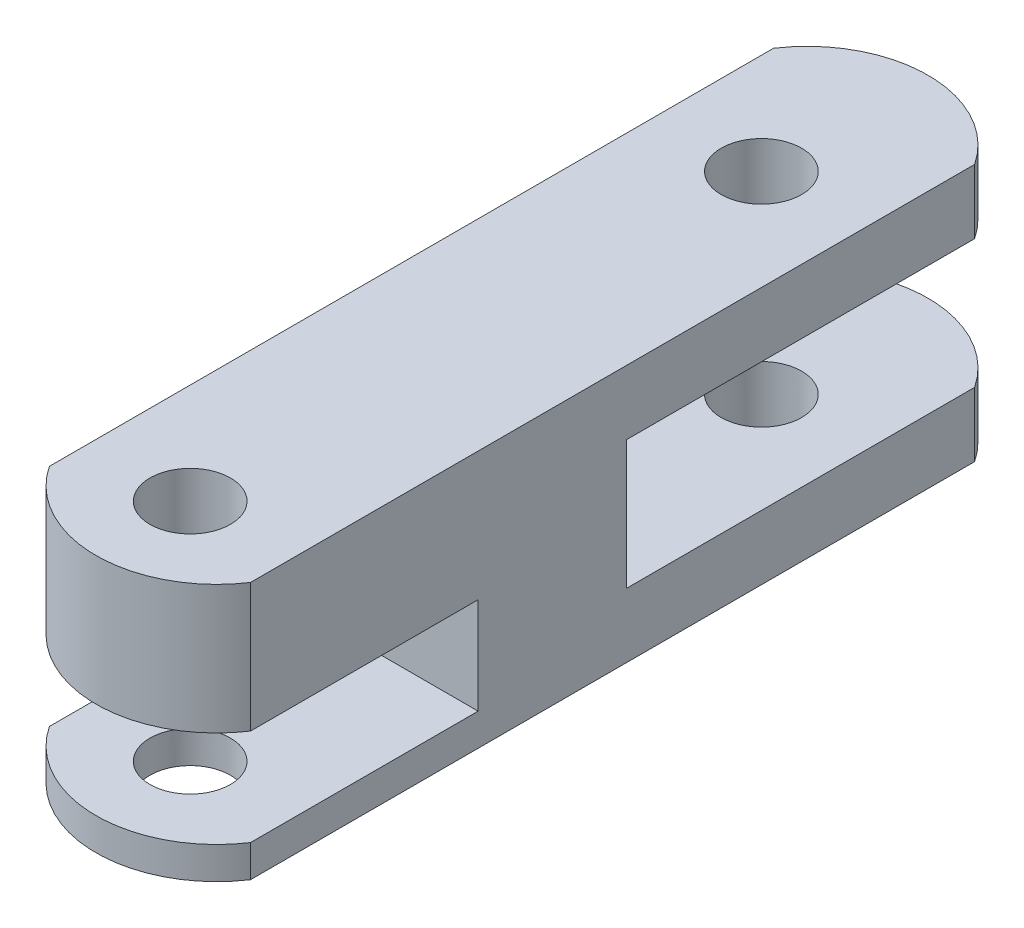
ISO-10303-21;
HEADER;
FILE_DESCRIPTION(('STEP AP214'),'2;1');
FILE_NAME('part.step','',(''),(''),'','','');
FILE_SCHEMA(('AUTOMOTIVE_DESIGN { 1 0 10303 214 1 1 1 1 }'));
ENDSEC;
DATA;
#1=APPLICATION_CONTEXT('core data for automotive mechanical design processes');
#2=APPLICATION_PROTOCOL_DEFINITION('international standard','automotive_design',2000,#1);
#3=PRODUCT_CONTEXT('',#1,'mechanical');
#4=PRODUCT('Part','Part','',(#3));
#5=PRODUCT_RELATED_PRODUCT_CATEGORY('part','',(#4));
#6=PRODUCT_DEFINITION_FORMATION('','',#4);
#7=PRODUCT_DEFINITION_CONTEXT('part definition',#1,'design');
#8=PRODUCT_DEFINITION('design','',#6,#7);
#9=PRODUCT_DEFINITION_SHAPE('','',#8);
#10=(LENGTH_UNIT() NAMED_UNIT(*) SI_UNIT(.MILLI.,.METRE.));
#11=(NAMED_UNIT(*) PLANE_ANGLE_UNIT() SI_UNIT($,.RADIAN.));
#12=(NAMED_UNIT(*) SI_UNIT($,.STERADIAN.) SOLID_ANGLE_UNIT());
#13=UNCERTAINTY_MEASURE_WITH_UNIT(LENGTH_MEASURE(1.E-05),#10,'distance_accuracy_value','');
#14=(GEOMETRIC_REPRESENTATION_CONTEXT(3) GLOBAL_UNCERTAINTY_ASSIGNED_CONTEXT((#13)) GLOBAL_UNIT_ASSIGNED_CONTEXT((#10,
#11,#12)) REPRESENTATION_CONTEXT('',''));
#15=CARTESIAN_POINT('',(0.,0.,0.));
#16=DIRECTION('',(0.,0.,1.));
#17=DIRECTION('',(1.,0.,0.));
#18=AXIS2_PLACEMENT_3D('',#15,#16,#17);
#19=CARTESIAN_POINT('',(0.,16.,-36.7084380241115));
#20=DIRECTION('',(0.,-1.,0.));
#21=DIRECTION('',(0.,0.,-1.));
#22=AXIS2_PLACEMENT_3D('',#19,#20,#21);
#23=CYLINDRICAL_SURFACE('',#22,15.);
#24=DIRECTION('',(0.,-1.,0.));
#25=VECTOR('',#24,1.);
#26=CARTESIAN_POINT('',(12.5,16.,-45.));
#27=LINE('',#26,#25);
#28=CARTESIAN_POINT('',(12.5,16.,-45.));
#29=VERTEX_POINT('',#28);
#30=CARTESIAN_POINT('',(12.5,8.,-45.));
#31=VERTEX_POINT('',#30);
#32=EDGE_CURVE('E216',#29,#31,#27,.T.);
#33=ORIENTED_EDGE('',*,*,#32,.T.);
#34=CARTESIAN_POINT('',(0.,8.,-36.7084380241115));
#35=DIRECTION('',(0.,1.,0.));
#36=DIRECTION('',(0.,0.,1.));
#37=AXIS2_PLACEMENT_3D('',#34,#35,#36);
#38=CIRCLE('',#37,15.);
#39=CARTESIAN_POINT('',(-12.5,8.,-45.));
#40=VERTEX_POINT('',#39);
#41=EDGE_CURVE('E163',#31,#40,#38,.T.);
#42=ORIENTED_EDGE('',*,*,#41,.T.);
#43=DIRECTION('',(0.,-1.,0.));
#44=VECTOR('',#43,1.);
#45=CARTESIAN_POINT('',(-12.5,16.,-45.));
#46=LINE('',#45,#44);
#47=CARTESIAN_POINT('',(-12.5,16.,-45.));
#48=VERTEX_POINT('',#47);
#49=EDGE_CURVE('E213',#48,#40,#46,.T.);
#50=ORIENTED_EDGE('',*,*,#49,.F.);
#51=CARTESIAN_POINT('',(0.,16.,-36.7084380241115));
#52=DIRECTION('',(0.,1.,0.));
#53=DIRECTION('',(0.,0.,-1.));
#54=AXIS2_PLACEMENT_3D('',#51,#52,#53);
#55=CIRCLE('',#54,15.);
#56=EDGE_CURVE('E194',#29,#48,#55,.T.);
#57=ORIENTED_EDGE('',*,*,#56,.F.);
#58=EDGE_LOOP('',(#33,#42,#50,#57));
#59=FACE_BOUND('',#58,.T.);
#60=ADVANCED_FACE('F41',(#59),#23,.T.);
#61=CARTESIAN_POINT('',(0.,16.,36.7084380241115));
#62=DIRECTION('',(0.,-1.,0.));
#63=DIRECTION('',(0.,0.,-1.));
#64=AXIS2_PLACEMENT_3D('',#61,#62,#63);
#65=CYLINDRICAL_SURFACE('',#64,15.);
#66=DIRECTION('',(0.,-1.,0.));
#67=VECTOR('',#66,1.);
#68=CARTESIAN_POINT('',(-12.5,16.,45.));
#69=LINE('',#68,#67);
#70=CARTESIAN_POINT('',(-12.5,16.,45.));
#71=VERTEX_POINT('',#70);
#72=CARTESIAN_POINT('',(-12.5,0.,45.));
#73=VERTEX_POINT('',#72);
#74=EDGE_CURVE('E209',#71,#73,#69,.T.);
#75=ORIENTED_EDGE('',*,*,#74,.T.);
#76=CARTESIAN_POINT('',(0.,0.,36.7084380241115));
#77=DIRECTION('',(0.,1.,0.));
#78=DIRECTION('',(0.,0.,1.));
#79=AXIS2_PLACEMENT_3D('',#76,#77,#78);
#80=CIRCLE('',#79,15.);
#81=CARTESIAN_POINT('',(12.5,0.,45.));
#82=VERTEX_POINT('',#81);
#83=EDGE_CURVE('E184',#73,#82,#80,.T.);
#84=ORIENTED_EDGE('',*,*,#83,.T.);
#85=DIRECTION('',(0.,-1.,0.));
#86=VECTOR('',#85,1.);
#87=CARTESIAN_POINT('',(12.5,16.,45.));
#88=LINE('',#87,#86);
#89=CARTESIAN_POINT('',(12.5,16.,45.));
#90=VERTEX_POINT('',#89);
#91=EDGE_CURVE('E220',#90,#82,#88,.T.);
#92=ORIENTED_EDGE('',*,*,#91,.F.);
#93=CARTESIAN_POINT('',(0.,16.,36.7084380241115));
#94=DIRECTION('',(0.,1.,0.));
#95=DIRECTION('',(0.,0.,1.));
#96=AXIS2_PLACEMENT_3D('',#93,#94,#95);
#97=CIRCLE('',#96,15.);
#98=EDGE_CURVE('E188',#71,#90,#97,.T.);
#99=ORIENTED_EDGE('',*,*,#98,.F.);
#100=EDGE_LOOP('',(#75,#84,#92,#99));
#101=FACE_BOUND('',#100,.T.);
#102=ADVANCED_FACE('F265',(#101),#65,.T.);
#103=CARTESIAN_POINT('',(12.5,-12.,45.));
#104=VERTEX_POINT('',#103);
#105=CARTESIAN_POINT('',(12.5,-16.,45.));
#106=VERTEX_POINT('',#105);
#107=EDGE_CURVE('E219',#104,#106,#88,.T.);
#108=ORIENTED_EDGE('',*,*,#107,.F.);
#109=CARTESIAN_POINT('',(0.,-12.,36.7084380241115));
#110=DIRECTION('',(0.,-1.,0.));
#111=DIRECTION('',(0.,0.,-1.));
#112=AXIS2_PLACEMENT_3D('',#109,#110,#111);
#113=CIRCLE('',#112,15.);
#114=CARTESIAN_POINT('',(-12.5,-12.,45.));
#115=VERTEX_POINT('',#114);
#116=EDGE_CURVE('E180',#104,#115,#113,.T.);
#117=ORIENTED_EDGE('',*,*,#116,.T.);
#118=CARTESIAN_POINT('',(-12.5,-16.,45.));
#119=VERTEX_POINT('',#118);
#120=EDGE_CURVE('E198',#115,#119,#69,.T.);
#121=ORIENTED_EDGE('',*,*,#120,.T.);
#122=CARTESIAN_POINT('',(0.,-16.,36.7084380241115));
#123=DIRECTION('',(0.,1.,0.));
#124=DIRECTION('',(0.,0.,1.));
#125=AXIS2_PLACEMENT_3D('',#122,#123,#124);
#126=CIRCLE('',#125,15.);
#127=EDGE_CURVE('E187',#119,#106,#126,.T.);
#128=ORIENTED_EDGE('',*,*,#127,.T.);
#129=EDGE_LOOP('',(#108,#117,#121,#128));
#130=FACE_BOUND('',#129,.T.);
#131=ADVANCED_FACE('F43',(#130),#65,.T.);
#132=CARTESIAN_POINT('',(12.5,16.,-45.));
#133=DIRECTION('',(-1.,0.,0.));
#134=DIRECTION('',(0.,0.,1.));
#135=AXIS2_PLACEMENT_3D('',#132,#133,#134);
#136=PLANE('',#135);
#137=DIRECTION('',(0.,-1.,0.));
#138=VECTOR('',#137,1.);
#139=CARTESIAN_POINT('',(12.5,8.,-1.70843802411149));
#140=LINE('',#139,#138);
#141=CARTESIAN_POINT('',(12.5,8.,-1.70843802411149));
#142=VERTEX_POINT('',#141);
#143=CARTESIAN_POINT('',(12.5,-8.,-1.70843802411149));
#144=VERTEX_POINT('',#143);
#145=EDGE_CURVE('E140',#142,#144,#140,.T.);
#146=ORIENTED_EDGE('',*,*,#145,.F.);
#147=DIRECTION('',(0.,0.,1.));
#148=VECTOR('',#147,1.);
#149=CARTESIAN_POINT('',(12.5,8.,-88.2915619758885));
#150=LINE('',#149,#148);
#151=EDGE_CURVE('E151',#31,#142,#150,.T.);
#152=ORIENTED_EDGE('',*,*,#151,.F.);
#153=ORIENTED_EDGE('',*,*,#32,.F.);
#154=DIRECTION('',(0.,0.,-1.));
#155=VECTOR('',#154,1.);
#156=CARTESIAN_POINT('',(12.5,16.,-45.));
#157=LINE('',#156,#155);
#158=EDGE_CURVE('E191',#90,#29,#157,.T.);
#159=ORIENTED_EDGE('',*,*,#158,.F.);
#160=ORIENTED_EDGE('',*,*,#91,.T.);
#161=DIRECTION('',(0.,0.,1.));
#162=VECTOR('',#161,1.);
#163=CARTESIAN_POINT('',(12.5,0.,16.7084380241115));
#164=LINE('',#163,#162);
#165=CARTESIAN_POINT('',(12.5,0.,16.7084380241115));
#166=VERTEX_POINT('',#165);
#167=EDGE_CURVE('E169',#166,#82,#164,.T.);
#168=ORIENTED_EDGE('',*,*,#167,.F.);
#169=DIRECTION('',(0.,1.,0.));
#170=VECTOR('',#169,1.);
#171=CARTESIAN_POINT('',(12.5,0.,16.7084380241115));
#172=LINE('',#171,#170);
#173=CARTESIAN_POINT('',(12.5,-12.,16.7084380241115));
#174=VERTEX_POINT('',#173);
#175=EDGE_CURVE('E174',#174,#166,#172,.T.);
#176=ORIENTED_EDGE('',*,*,#175,.F.);
#177=DIRECTION('',(0.,0.,-1.));
#178=VECTOR('',#177,1.);
#179=CARTESIAN_POINT('',(12.5,-12.,16.7084380241115));
#180=LINE('',#179,#178);
#181=EDGE_CURVE('E166',#104,#174,#180,.T.);
#182=ORIENTED_EDGE('',*,*,#181,.F.);
#183=ORIENTED_EDGE('',*,*,#107,.T.);
#184=DIRECTION('',(0.,0.,-1.));
#185=VECTOR('',#184,1.);
#186=CARTESIAN_POINT('',(12.5,-16.,-45.));
#187=LINE('',#186,#185);
#188=CARTESIAN_POINT('',(12.5,-16.,-45.));
#189=VERTEX_POINT('',#188);
#190=EDGE_CURVE('E201',#106,#189,#187,.T.);
#191=ORIENTED_EDGE('',*,*,#190,.T.);
#192=CARTESIAN_POINT('',(12.5,-8.,-45.));
#193=VERTEX_POINT('',#192);
#194=EDGE_CURVE('E215',#193,#189,#27,.T.);
#195=ORIENTED_EDGE('',*,*,#194,.F.);
#196=DIRECTION('',(0.,0.,-1.));
#197=VECTOR('',#196,1.);
#198=CARTESIAN_POINT('',(12.5,-8.,-88.2915619758885));
#199=LINE('',#198,#197);
#200=EDGE_CURVE('E153',#144,#193,#199,.T.);
#201=ORIENTED_EDGE('',*,*,#200,.F.);
#202=EDGE_LOOP('',(#146,#152,#153,#159,#160,#168,#176,#182,#183,#191,#195,#201));
#203=FACE_BOUND('',#202,.T.);
#204=ADVANCED_FACE('F277',(#203),#136,.F.);
#205=CARTESIAN_POINT('',(-12.5,-8.,-45.));
#206=VERTEX_POINT('',#205);
#207=CARTESIAN_POINT('',(-12.5,-16.,-45.));
#208=VERTEX_POINT('',#207);
#209=EDGE_CURVE('E212',#206,#208,#46,.T.);
#210=ORIENTED_EDGE('',*,*,#209,.F.);
#211=CARTESIAN_POINT('',(0.,-8.,-36.7084380241115));
#212=DIRECTION('',(0.,-1.,0.));
#213=DIRECTION('',(0.,0.,-1.));
#214=AXIS2_PLACEMENT_3D('',#211,#212,#213);
#215=CIRCLE('',#214,15.);
#216=EDGE_CURVE('E58',#206,#193,#215,.T.);
#217=ORIENTED_EDGE('',*,*,#216,.T.);
#218=ORIENTED_EDGE('',*,*,#194,.T.);
#219=CARTESIAN_POINT('',(0.,-16.,-36.7084380241115));
#220=DIRECTION('',(0.,1.,0.));
#221=DIRECTION('',(0.,0.,-1.));
#222=AXIS2_PLACEMENT_3D('',#219,#220,#221);
#223=CIRCLE('',#222,15.);
#224=EDGE_CURVE('E204',#189,#208,#223,.T.);
#225=ORIENTED_EDGE('',*,*,#224,.T.);
#226=EDGE_LOOP('',(#210,#217,#218,#225));
#227=FACE_BOUND('',#226,.T.);
#228=ADVANCED_FACE('F268',(#227),#23,.T.);
#229=CARTESIAN_POINT('',(-12.5,16.,-45.));
#230=DIRECTION('',(1.,0.,0.));
#231=DIRECTION('',(0.,0.,-1.));
#232=AXIS2_PLACEMENT_3D('',#229,#230,#231);
#233=PLANE('',#232);
#234=ORIENTED_EDGE('',*,*,#49,.T.);
#235=DIRECTION('',(0.,0.,1.));
#236=VECTOR('',#235,1.);
#237=CARTESIAN_POINT('',(-12.5,8.,-45.));
#238=LINE('',#237,#236);
#239=CARTESIAN_POINT('',(-12.5,8.,-1.70843802411149));
#240=VERTEX_POINT('',#239);
#241=EDGE_CURVE('E11',#40,#240,#238,.T.);
#242=ORIENTED_EDGE('',*,*,#241,.T.);
#243=DIRECTION('',(0.,-1.,0.));
#244=VECTOR('',#243,1.);
#245=CARTESIAN_POINT('',(-12.5,8.,-1.70843802411149));
#246=LINE('',#245,#244);
#247=CARTESIAN_POINT('',(-12.5,-8.,-1.70843802411149));
#248=VERTEX_POINT('',#247);
#249=EDGE_CURVE('E138',#240,#248,#246,.T.);
#250=ORIENTED_EDGE('',*,*,#249,.T.);
#251=DIRECTION('',(0.,0.,-1.));
#252=VECTOR('',#251,1.);
#253=CARTESIAN_POINT('',(-12.5,-8.,-88.2915619758885));
#254=LINE('',#253,#252);
#255=EDGE_CURVE('E143',#248,#206,#254,.T.);
#256=ORIENTED_EDGE('',*,*,#255,.T.);
#257=ORIENTED_EDGE('',*,*,#209,.T.);
#258=DIRECTION('',(0.,0.,1.));
#259=VECTOR('',#258,1.);
#260=CARTESIAN_POINT('',(-12.5,-16.,-45.));
#261=LINE('',#260,#259);
#262=EDGE_CURVE('E192',#208,#119,#261,.T.);
#263=ORIENTED_EDGE('',*,*,#262,.T.);
#264=ORIENTED_EDGE('',*,*,#120,.F.);
#265=DIRECTION('',(0.,0.,-1.));
#266=VECTOR('',#265,1.);
#267=CARTESIAN_POINT('',(-12.5,-12.,-45.));
#268=LINE('',#267,#266);
#269=CARTESIAN_POINT('',(-12.5,-12.,16.7084380241115));
#270=VERTEX_POINT('',#269);
#271=EDGE_CURVE('E50',#115,#270,#268,.T.);
#272=ORIENTED_EDGE('',*,*,#271,.T.);
#273=DIRECTION('',(0.,1.,0.));
#274=VECTOR('',#273,1.);
#275=CARTESIAN_POINT('',(-12.5,0.,16.7084380241115));
#276=LINE('',#275,#274);
#277=CARTESIAN_POINT('',(-12.5,0.,16.7084380241115));
#278=VERTEX_POINT('',#277);
#279=EDGE_CURVE('E66',#270,#278,#276,.T.);
#280=ORIENTED_EDGE('',*,*,#279,.T.);
#281=DIRECTION('',(0.,0.,1.));
#282=VECTOR('',#281,1.);
#283=CARTESIAN_POINT('',(-12.5,0.,16.7084380241115));
#284=LINE('',#283,#282);
#285=EDGE_CURVE('E168',#278,#73,#284,.T.);
#286=ORIENTED_EDGE('',*,*,#285,.T.);
#287=ORIENTED_EDGE('',*,*,#74,.F.);
#288=DIRECTION('',(0.,0.,1.));
#289=VECTOR('',#288,1.);
#290=CARTESIAN_POINT('',(-12.5,16.,-45.));
#291=LINE('',#290,#289);
#292=EDGE_CURVE('E196',#48,#71,#291,.T.);
#293=ORIENTED_EDGE('',*,*,#292,.F.);
#294=EDGE_LOOP('',(#234,#242,#250,#256,#257,#263,#264,#272,#280,#286,#287,#293));
#295=FACE_BOUND('',#294,.T.);
#296=ADVANCED_FACE('F150',(#295),#233,.F.);
#297=CARTESIAN_POINT('',(0.,16.,36.7084380241115));
#298=DIRECTION('',(0.,1.,0.));
#299=DIRECTION('',(0.,0.,1.));
#300=AXIS2_PLACEMENT_3D('',#297,#298,#299);
#301=PLANE('',#300);
#302=CARTESIAN_POINT('',(0.,16.,40.));
#303=DIRECTION('',(0.,1.,0.));
#304=DIRECTION('',(0.,0.,1.));
#305=AXIS2_PLACEMENT_3D('',#302,#303,#304);
#306=CIRCLE('',#305,5.);
#307=CARTESIAN_POINT('',(0.,16.,45.));
#308=VERTEX_POINT('',#307);
#309=EDGE_CURVE('E232',#308,#308,#306,.T.);
#310=ORIENTED_EDGE('',*,*,#309,.F.);
#311=EDGE_LOOP('',(#310));
#312=FACE_BOUND('',#311,.T.);
#313=CARTESIAN_POINT('',(0.,16.,-31.));
#314=DIRECTION('',(0.,1.,0.));
#315=DIRECTION('',(0.,0.,1.));
#316=AXIS2_PLACEMENT_3D('',#313,#314,#315);
#317=CIRCLE('',#316,5.);
#318=CARTESIAN_POINT('',(0.,16.,-26.));
#319=VERTEX_POINT('',#318);
#320=EDGE_CURVE('E237',#319,#319,#317,.T.);
#321=ORIENTED_EDGE('',*,*,#320,.F.);
#322=EDGE_LOOP('',(#321));
#323=FACE_BOUND('',#322,.T.);
#324=ORIENTED_EDGE('',*,*,#98,.T.);
#325=ORIENTED_EDGE('',*,*,#158,.T.);
#326=ORIENTED_EDGE('',*,*,#56,.T.);
#327=ORIENTED_EDGE('',*,*,#292,.T.);
#328=EDGE_LOOP('',(#324,#325,#326,#327));
#329=FACE_BOUND('',#328,.T.);
#330=ADVANCED_FACE('F282',(#312,#323,#329),#301,.T.);
#331=CARTESIAN_POINT('',(0.,-16.,36.7084380241115));
#332=DIRECTION('',(0.,1.,0.));
#333=DIRECTION('',(0.,0.,1.));
#334=AXIS2_PLACEMENT_3D('',#331,#332,#333);
#335=PLANE('',#334);
#336=CARTESIAN_POINT('',(0.,-16.,40.));
#337=DIRECTION('',(0.,1.,0.));
#338=DIRECTION('',(0.,0.,1.));
#339=AXIS2_PLACEMENT_3D('',#336,#337,#338);
#340=CIRCLE('',#339,5.);
#341=CARTESIAN_POINT('',(0.,-16.,45.));
#342=VERTEX_POINT('',#341);
#343=EDGE_CURVE('E227',#342,#342,#340,.T.);
#344=ORIENTED_EDGE('',*,*,#343,.T.);
#345=EDGE_LOOP('',(#344));
#346=FACE_BOUND('',#345,.T.);
#347=CARTESIAN_POINT('',(0.,-16.,-31.));
#348=DIRECTION('',(0.,1.,0.));
#349=DIRECTION('',(0.,0.,1.));
#350=AXIS2_PLACEMENT_3D('',#347,#348,#349);
#351=CIRCLE('',#350,5.);
#352=CARTESIAN_POINT('',(0.,-16.,-26.));
#353=VERTEX_POINT('',#352);
#354=EDGE_CURVE('E242',#353,#353,#351,.T.);
#355=ORIENTED_EDGE('',*,*,#354,.T.);
#356=EDGE_LOOP('',(#355));
#357=FACE_BOUND('',#356,.T.);
#358=ORIENTED_EDGE('',*,*,#127,.F.);
#359=ORIENTED_EDGE('',*,*,#262,.F.);
#360=ORIENTED_EDGE('',*,*,#224,.F.);
#361=ORIENTED_EDGE('',*,*,#190,.F.);
#362=EDGE_LOOP('',(#358,#359,#360,#361));
#363=FACE_BOUND('',#362,.T.);
#364=ADVANCED_FACE('F246',(#346,#357,#363),#335,.F.);
#365=CARTESIAN_POINT('',(-12.5,0.,16.7084380241115));
#366=DIRECTION('',(0.,1.,0.));
#367=DIRECTION('',(0.,0.,1.));
#368=AXIS2_PLACEMENT_3D('',#365,#366,#367);
#369=PLANE('',#368);
#370=CARTESIAN_POINT('',(0.,0.,40.));
#371=DIRECTION('',(0.,1.,0.));
#372=DIRECTION('',(0.,0.,1.));
#373=AXIS2_PLACEMENT_3D('',#370,#371,#372);
#374=CIRCLE('',#373,5.);
#375=CARTESIAN_POINT('',(0.,0.,45.));
#376=VERTEX_POINT('',#375);
#377=EDGE_CURVE('E156',#376,#376,#374,.T.);
#378=ORIENTED_EDGE('',*,*,#377,.T.);
#379=EDGE_LOOP('',(#378));
#380=FACE_BOUND('',#379,.T.);
#381=ORIENTED_EDGE('',*,*,#285,.F.);
#382=DIRECTION('',(1.,0.,0.));
#383=VECTOR('',#382,1.);
#384=CARTESIAN_POINT('',(-12.5,0.,16.7084380241115));
#385=LINE('',#384,#383);
#386=EDGE_CURVE('E178',#278,#166,#385,.T.);
#387=ORIENTED_EDGE('',*,*,#386,.T.);
#388=ORIENTED_EDGE('',*,*,#167,.T.);
#389=ORIENTED_EDGE('',*,*,#83,.F.);
#390=EDGE_LOOP('',(#381,#387,#388,#389));
#391=FACE_BOUND('',#390,.T.);
#392=ADVANCED_FACE('F319',(#380,#391),#369,.F.);
#393=CARTESIAN_POINT('',(-12.5,-12.,16.7084380241115));
#394=DIRECTION('',(0.,-1.,0.));
#395=DIRECTION('',(0.,0.,-1.));
#396=AXIS2_PLACEMENT_3D('',#393,#394,#395);
#397=PLANE('',#396);
#398=CARTESIAN_POINT('',(0.,-12.,40.));
#399=DIRECTION('',(0.,-1.,0.));
#400=DIRECTION('',(0.,0.,-1.));
#401=AXIS2_PLACEMENT_3D('',#398,#399,#400);
#402=CIRCLE('',#401,5.);
#403=CARTESIAN_POINT('',(0.,-12.,35.));
#404=VERTEX_POINT('',#403);
#405=EDGE_CURVE('E45',#404,#404,#402,.T.);
#406=ORIENTED_EDGE('',*,*,#405,.T.);
#407=EDGE_LOOP('',(#406));
#408=FACE_BOUND('',#407,.T.);
#409=ORIENTED_EDGE('',*,*,#181,.T.);
#410=DIRECTION('',(1.,0.,0.));
#411=VECTOR('',#410,1.);
#412=CARTESIAN_POINT('',(-12.5,-12.,16.7084380241115));
#413=LINE('',#412,#411);
#414=EDGE_CURVE('E172',#270,#174,#413,.T.);
#415=ORIENTED_EDGE('',*,*,#414,.F.);
#416=ORIENTED_EDGE('',*,*,#271,.F.);
#417=ORIENTED_EDGE('',*,*,#116,.F.);
#418=EDGE_LOOP('',(#409,#415,#416,#417));
#419=FACE_BOUND('',#418,.T.);
#420=ADVANCED_FACE('F294',(#408,#419),#397,.F.);
#421=CARTESIAN_POINT('',(-12.5,0.,16.7084380241115));
#422=DIRECTION('',(0.,0.,-1.));
#423=DIRECTION('',(-1.,0.,0.));
#424=AXIS2_PLACEMENT_3D('',#421,#422,#423);
#425=PLANE('',#424);
#426=ORIENTED_EDGE('',*,*,#175,.T.);
#427=ORIENTED_EDGE('',*,*,#386,.F.);
#428=ORIENTED_EDGE('',*,*,#279,.F.);
#429=ORIENTED_EDGE('',*,*,#414,.T.);
#430=EDGE_LOOP('',(#426,#427,#428,#429));
#431=FACE_BOUND('',#430,.T.);
#432=ADVANCED_FACE('F297',(#431),#425,.F.);
#433=CARTESIAN_POINT('',(-12.5,8.,-88.2915619758885));
#434=DIRECTION('',(0.,1.,0.));
#435=DIRECTION('',(0.,0.,1.));
#436=AXIS2_PLACEMENT_3D('',#433,#434,#435);
#437=PLANE('',#436);
#438=CARTESIAN_POINT('',(0.,8.,-31.));
#439=DIRECTION('',(0.,1.,0.));
#440=DIRECTION('',(0.,0.,1.));
#441=AXIS2_PLACEMENT_3D('',#438,#439,#440);
#442=CIRCLE('',#441,5.);
#443=CARTESIAN_POINT('',(0.,8.,-26.));
#444=VERTEX_POINT('',#443);
#445=EDGE_CURVE('E226',#444,#444,#442,.T.);
#446=ORIENTED_EDGE('',*,*,#445,.T.);
#447=EDGE_LOOP('',(#446));
#448=FACE_BOUND('',#447,.T.);
#449=ORIENTED_EDGE('',*,*,#151,.T.);
#450=DIRECTION('',(1.,0.,0.));
#451=VECTOR('',#450,1.);
#452=CARTESIAN_POINT('',(-12.5,8.,-1.70843802411149));
#453=LINE('',#452,#451);
#454=EDGE_CURVE('E142',#240,#142,#453,.T.);
#455=ORIENTED_EDGE('',*,*,#454,.F.);
#456=ORIENTED_EDGE('',*,*,#241,.F.);
#457=ORIENTED_EDGE('',*,*,#41,.F.);
#458=EDGE_LOOP('',(#449,#455,#456,#457));
#459=FACE_BOUND('',#458,.T.);
#460=ADVANCED_FACE('F310',(#448,#459),#437,.F.);
#461=CARTESIAN_POINT('',(-12.5,-8.,-88.2915619758885));
#462=DIRECTION('',(0.,-1.,0.));
#463=DIRECTION('',(0.,0.,-1.));
#464=AXIS2_PLACEMENT_3D('',#461,#462,#463);
#465=PLANE('',#464);
#466=CARTESIAN_POINT('',(0.,-8.,-31.));
#467=DIRECTION('',(0.,-1.,0.));
#468=DIRECTION('',(0.,0.,-1.));
#469=AXIS2_PLACEMENT_3D('',#466,#467,#468);
#470=CIRCLE('',#469,5.);
#471=CARTESIAN_POINT('',(0.,-8.,-36.));
#472=VERTEX_POINT('',#471);
#473=EDGE_CURVE('E224',#472,#472,#470,.T.);
#474=ORIENTED_EDGE('',*,*,#473,.T.);
#475=EDGE_LOOP('',(#474));
#476=FACE_BOUND('',#475,.T.);
#477=ORIENTED_EDGE('',*,*,#255,.F.);
#478=DIRECTION('',(1.,0.,0.));
#479=VECTOR('',#478,1.);
#480=CARTESIAN_POINT('',(-12.5,-8.,-1.70843802411149));
#481=LINE('',#480,#479);
#482=EDGE_CURVE('E134',#248,#144,#481,.T.);
#483=ORIENTED_EDGE('',*,*,#482,.T.);
#484=ORIENTED_EDGE('',*,*,#200,.T.);
#485=ORIENTED_EDGE('',*,*,#216,.F.);
#486=EDGE_LOOP('',(#477,#483,#484,#485));
#487=FACE_BOUND('',#486,.T.);
#488=ADVANCED_FACE('F145',(#476,#487),#465,.F.);
#489=CARTESIAN_POINT('',(-12.5,8.,-1.70843802411149));
#490=DIRECTION('',(0.,0.,1.));
#491=DIRECTION('',(1.,0.,0.));
#492=AXIS2_PLACEMENT_3D('',#489,#490,#491);
#493=PLANE('',#492);
#494=ORIENTED_EDGE('',*,*,#145,.T.);
#495=ORIENTED_EDGE('',*,*,#482,.F.);
#496=ORIENTED_EDGE('',*,*,#249,.F.);
#497=ORIENTED_EDGE('',*,*,#454,.T.);
#498=EDGE_LOOP('',(#494,#495,#496,#497));
#499=FACE_BOUND('',#498,.T.);
#500=ADVANCED_FACE('F135',(#499),#493,.F.);
#501=CARTESIAN_POINT('',(0.,-16.,-31.));
#502=DIRECTION('',(0.,1.,0.));
#503=DIRECTION('',(0.,0.,1.));
#504=AXIS2_PLACEMENT_3D('',#501,#502,#503);
#505=CYLINDRICAL_SURFACE('',#504,5.);
#506=ORIENTED_EDGE('',*,*,#354,.F.);
#507=EDGE_LOOP('',(#506));
#508=FACE_BOUND('',#507,.T.);
#509=ORIENTED_EDGE('',*,*,#473,.F.);
#510=EDGE_LOOP('',(#509));
#511=FACE_BOUND('',#510,.T.);
#512=ADVANCED_FACE('F249',(#508,#511),#505,.F.);
#513=ORIENTED_EDGE('',*,*,#320,.T.);
#514=EDGE_LOOP('',(#513));
#515=FACE_BOUND('',#514,.T.);
#516=ORIENTED_EDGE('',*,*,#445,.F.);
#517=EDGE_LOOP('',(#516));
#518=FACE_BOUND('',#517,.T.);
#519=ADVANCED_FACE('F252',(#515,#518),#505,.F.);
#520=CARTESIAN_POINT('',(0.,-16.,40.));
#521=DIRECTION('',(0.,1.,0.));
#522=DIRECTION('',(0.,0.,1.));
#523=AXIS2_PLACEMENT_3D('',#520,#521,#522);
#524=CYLINDRICAL_SURFACE('',#523,5.);
#525=ORIENTED_EDGE('',*,*,#343,.F.);
#526=EDGE_LOOP('',(#525));
#527=FACE_BOUND('',#526,.T.);
#528=ORIENTED_EDGE('',*,*,#405,.F.);
#529=EDGE_LOOP('',(#528));
#530=FACE_BOUND('',#529,.T.);
#531=ADVANCED_FACE('F258',(#527,#530),#524,.F.);
#532=ORIENTED_EDGE('',*,*,#309,.T.);
#533=EDGE_LOOP('',(#532));
#534=FACE_BOUND('',#533,.T.);
#535=ORIENTED_EDGE('',*,*,#377,.F.);
#536=EDGE_LOOP('',(#535));
#537=FACE_BOUND('',#536,.T.);
#538=ADVANCED_FACE('F391',(#534,#537),#524,.F.);
#539=CLOSED_SHELL('',(#60,#102,#131,#204,#228,#296,#330,#364,#392,#420,#432,#460,#488,#500,#512,
#519,#531,#538));
#540=MANIFOLD_SOLID_BREP('B2',#539);
#541=ADVANCED_BREP_SHAPE_REPRESENTATION('',(#18,#540),#14);
#542=SHAPE_DEFINITION_REPRESENTATION(#9,#541);
ENDSEC;
END-ISO-10303-21;
